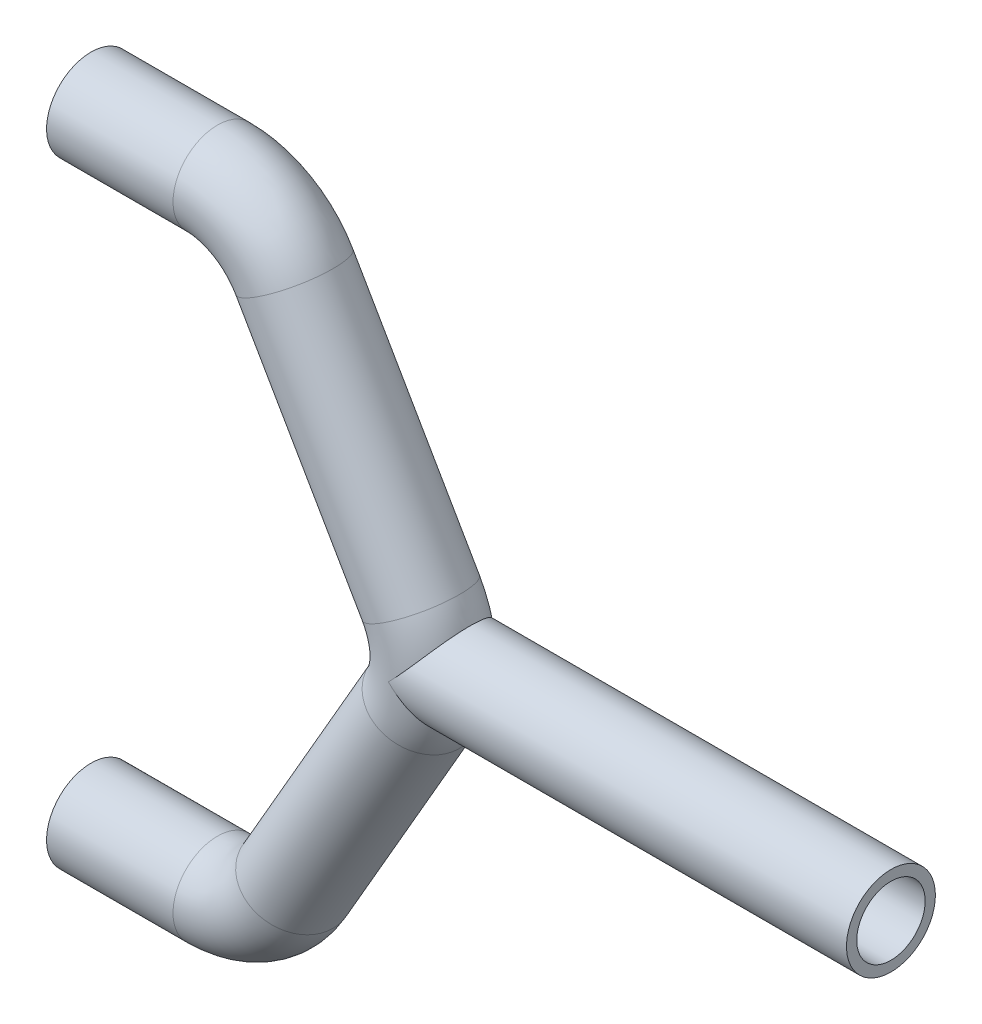
ISO-10303-21;
HEADER;
FILE_DESCRIPTION(('STEP AP214'),'2;1');
FILE_NAME('part.step','',(''),(''),'','','');
FILE_SCHEMA(('AUTOMOTIVE_DESIGN { 1 0 10303 214 1 1 1 1 }'));
ENDSEC;
DATA;
#1=APPLICATION_CONTEXT('core data for automotive mechanical design processes');
#2=APPLICATION_PROTOCOL_DEFINITION('international standard','automotive_design',2000,#1);
#3=PRODUCT_CONTEXT('',#1,'mechanical');
#4=PRODUCT('Part','Part','',(#3));
#5=PRODUCT_RELATED_PRODUCT_CATEGORY('part','',(#4));
#6=PRODUCT_DEFINITION_FORMATION('','',#4);
#7=PRODUCT_DEFINITION_CONTEXT('part definition',#1,'design');
#8=PRODUCT_DEFINITION('design','',#6,#7);
#9=PRODUCT_DEFINITION_SHAPE('','',#8);
#10=(LENGTH_UNIT() NAMED_UNIT(*) SI_UNIT(.MILLI.,.METRE.));
#11=(NAMED_UNIT(*) PLANE_ANGLE_UNIT() SI_UNIT($,.RADIAN.));
#12=(NAMED_UNIT(*) SI_UNIT($,.STERADIAN.) SOLID_ANGLE_UNIT());
#13=UNCERTAINTY_MEASURE_WITH_UNIT(LENGTH_MEASURE(1.E-05),#10,'distance_accuracy_value','');
#14=(GEOMETRIC_REPRESENTATION_CONTEXT(3) GLOBAL_UNCERTAINTY_ASSIGNED_CONTEXT((#13)) GLOBAL_UNIT_ASSIGNED_CONTEXT((#10,
#11,#12)) REPRESENTATION_CONTEXT('',''));
#15=CARTESIAN_POINT('',(0.,0.,0.));
#16=DIRECTION('',(0.,0.,1.));
#17=DIRECTION('',(1.,0.,0.));
#18=AXIS2_PLACEMENT_3D('',#15,#16,#17);
#19=CARTESIAN_POINT('',(-79.9999999999998,-69.2820323027552,0.));
#20=DIRECTION('',(1.,0.,0.));
#21=DIRECTION('',(0.,0.,-1.));
#22=AXIS2_PLACEMENT_3D('',#19,#20,#21);
#23=PLANE('',#22);
#24=CARTESIAN_POINT('',(-79.9999999999998,-69.2820323027552,0.));
#25=DIRECTION('',(1.,0.,0.));
#26=DIRECTION('',(0.,0.,-1.));
#27=AXIS2_PLACEMENT_3D('',#24,#25,#26);
#28=CIRCLE('',#27,7.7);
#29=CARTESIAN_POINT('',(-79.9999999999998,-69.2820323027552,-7.7));
#30=VERTEX_POINT('',#29);
#31=EDGE_CURVE('E85',#30,#30,#28,.T.);
#32=ORIENTED_EDGE('',*,*,#31,.T.);
#33=EDGE_LOOP('',(#32));
#34=FACE_BOUND('',#33,.T.);
#35=CARTESIAN_POINT('',(-79.9999999999998,-69.2820323027552,0.));
#36=DIRECTION('',(1.,0.,0.));
#37=DIRECTION('',(0.,0.,-1.));
#38=AXIS2_PLACEMENT_3D('',#35,#36,#37);
#39=CIRCLE('',#38,10.);
#40=CARTESIAN_POINT('',(-79.9999999999998,-69.2820323027552,-10.));
#41=VERTEX_POINT('',#40);
#42=EDGE_CURVE('E204',#41,#41,#39,.T.);
#43=ORIENTED_EDGE('',*,*,#42,.F.);
#44=EDGE_LOOP('',(#43));
#45=FACE_BOUND('',#44,.T.);
#46=ADVANCED_FACE('F53',(#34,#45),#23,.F.);
#47=CARTESIAN_POINT('',(-79.9999999999998,69.2820323027552,0.));
#48=DIRECTION('',(-1.,0.,0.));
#49=DIRECTION('',(0.,0.,-1.));
#50=AXIS2_PLACEMENT_3D('',#47,#48,#49);
#51=PLANE('',#50);
#52=CARTESIAN_POINT('',(-79.9999999999998,69.2820323027552,0.));
#53=DIRECTION('',(-1.,0.,0.));
#54=DIRECTION('',(0.,0.,1.));
#55=AXIS2_PLACEMENT_3D('',#52,#53,#54);
#56=CIRCLE('',#55,7.7);
#57=CARTESIAN_POINT('',(-79.9999999999998,69.2820323027552,7.7));
#58=VERTEX_POINT('',#57);
#59=EDGE_CURVE('E165',#58,#58,#56,.T.);
#60=ORIENTED_EDGE('',*,*,#59,.F.);
#61=EDGE_LOOP('',(#60));
#62=FACE_BOUND('',#61,.T.);
#63=CARTESIAN_POINT('',(-79.9999999999998,69.2820323027552,0.));
#64=DIRECTION('',(-1.,0.,0.));
#65=DIRECTION('',(0.,0.,-1.));
#66=AXIS2_PLACEMENT_3D('',#63,#64,#65);
#67=CIRCLE('',#66,10.);
#68=CARTESIAN_POINT('',(-79.9999999999998,69.2820323027552,-10.));
#69=VERTEX_POINT('',#68);
#70=EDGE_CURVE('E12',#69,#69,#67,.T.);
#71=ORIENTED_EDGE('',*,*,#70,.T.);
#72=EDGE_LOOP('',(#71));
#73=FACE_BOUND('',#72,.T.);
#74=ADVANCED_FACE('F201',(#62,#73),#51,.T.);
#75=CARTESIAN_POINT('',(-79.9999999999998,-69.2820323027552,0.));
#76=DIRECTION('',(1.,0.,0.));
#77=DIRECTION('',(0.,0.,-1.));
#78=AXIS2_PLACEMENT_3D('',#75,#76,#77);
#79=CYLINDRICAL_SURFACE('',#78,10.);
#80=CARTESIAN_POINT('',(-51.5470053837925,-69.2820323027552,0.));
#81=DIRECTION('',(1.,0.,0.));
#82=DIRECTION('',(0.,0.,-1.));
#83=AXIS2_PLACEMENT_3D('',#80,#81,#82);
#84=CIRCLE('',#83,10.);
#85=CARTESIAN_POINT('',(-51.5470053837925,-79.2820323027556,0.));
#86=VERTEX_POINT('',#85);
#87=EDGE_CURVE('E207',#86,#86,#84,.T.);
#88=ORIENTED_EDGE('',*,*,#87,.F.);
#89=EDGE_LOOP('',(#88));
#90=FACE_BOUND('',#89,.T.);
#91=ORIENTED_EDGE('',*,*,#42,.T.);
#92=EDGE_LOOP('',(#91));
#93=FACE_BOUND('',#92,.T.);
#94=ADVANCED_FACE('F261',(#90,#93),#79,.T.);
#95=CARTESIAN_POINT('',(-51.5470053837924,-49.2820323027552,0.));
#96=DIRECTION('',(0.,0.,1.));
#97=DIRECTION('',(1.,0.,0.));
#98=AXIS2_PLACEMENT_3D('',#95,#96,#97);
#99=TOROIDAL_SURFACE('',#98,20.0000000000004,10.);
#100=CARTESIAN_POINT('',(-34.2264973081035,-59.2820323027551,0.));
#101=DIRECTION('',(0.499999999999994,0.866025403784442,0.));
#102=DIRECTION('',(0.,0.,-1.));
#103=AXIS2_PLACEMENT_3D('',#100,#101,#102);
#104=CIRCLE('',#103,10.);
#105=CARTESIAN_POINT('',(-25.5662432702587,-64.2820323027552,0.));
#106=VERTEX_POINT('',#105);
#107=EDGE_CURVE('E212',#106,#106,#104,.T.);
#108=CARTESIAN_POINT('',(-51.5470053837924,-49.2820323027552,0.));
#109=DIRECTION('',(0.,0.,1.));
#110=DIRECTION('',(1.,0.,0.));
#111=AXIS2_PLACEMENT_3D('',#108,#109,#110);
#112=CIRCLE('',#111,30.0000000000004);
#113=EDGE_CURVE('',#86,#106,#112,.T.);
#114=ORIENTED_EDGE('',*,*,#87,.T.);
#115=ORIENTED_EDGE('',*,*,#107,.F.);
#116=ORIENTED_EDGE('',*,*,#113,.T.);
#117=ORIENTED_EDGE('',*,*,#113,.F.);
#118=EDGE_LOOP('',(#114,#116,#115,#117));
#119=FACE_BOUND('',#118,.T.);
#120=ADVANCED_FACE('F255',(#119),#99,.T.);
#121=CARTESIAN_POINT('',(-34.2264973081035,-59.2820323027551,0.));
#122=DIRECTION('',(0.499999999999998,0.86602540378444,0.));
#123=DIRECTION('',(-0.86602540378444,0.499999999999998,0.));
#124=AXIS2_PLACEMENT_3D('',#121,#122,#123);
#125=CYLINDRICAL_SURFACE('',#124,10.);
#126=CARTESIAN_POINT('',(-5.7735026918962,-9.99999999999995,0.));
#127=DIRECTION('',(0.499999999999998,0.86602540378444,0.));
#128=DIRECTION('',(0.,0.,-1.));
#129=AXIS2_PLACEMENT_3D('',#126,#127,#128);
#130=CIRCLE('',#129,10.);
#131=CARTESIAN_POINT('',(-5.7735026918962,-9.99999999999995,-10.));
#132=VERTEX_POINT('',#131);
#133=EDGE_CURVE('E218',#132,#132,#130,.T.);
#134=ORIENTED_EDGE('',*,*,#133,.F.);
#135=EDGE_LOOP('',(#134));
#136=FACE_BOUND('',#135,.T.);
#137=ORIENTED_EDGE('',*,*,#107,.T.);
#138=EDGE_LOOP('',(#137));
#139=FACE_BOUND('',#138,.T.);
#140=ADVANCED_FACE('F249',(#136,#139),#125,.T.);
#141=CARTESIAN_POINT('',(-23.094010767585,0.,0.));
#142=DIRECTION('',(0.,0.,1.));
#143=DIRECTION('',(1.,0.,0.));
#144=AXIS2_PLACEMENT_3D('',#141,#142,#143);
#145=TOROIDAL_SURFACE('',#144,20.,10.);
#146=CARTESIAN_POINT('',(-3.094010767585,0.,-10.));
#147=CARTESIAN_POINT('',(-3.08929674735372,-0.00471401804463564,-10.0000000008236));
#148=CARTESIAN_POINT('',(-3.08458353438937,-0.00942889772434871,-9.99999666750356));
#149=CARTESIAN_POINT('',(-2.78144194122758,-0.312784942865242,-9.99956752964785));
#150=CARTESIAN_POINT('',(-2.48625985614368,-0.614863589772334,-9.98575914980761));
#151=CARTESIAN_POINT('',(-1.90354849074706,-1.22376923185965,-9.92954725907919));
#152=CARTESIAN_POINT('',(-1.61602061555535,-1.53059708274713,-9.88713853500289));
#153=CARTESIAN_POINT('',(-1.04925691139065,-2.1472684898138,-9.77178577673054));
#154=CARTESIAN_POINT('',(-0.770036615020611,-2.45711641317143,-9.69878797516481));
#155=CARTESIAN_POINT('',(-0.22182266923447,-3.07654711430385,-9.52043594187605));
#156=CARTESIAN_POINT('',(0.0471727781712034,-3.38612992925028,-9.41508742872353));
#157=CARTESIAN_POINT('',(0.530179526839191,-3.95134930605322,-9.19040502507429));
#158=CARTESIAN_POINT('',(0.745972238721851,-4.20750495677449,-9.07619977794326));
#159=CARTESIAN_POINT('',(1.16815277796409,-4.71520132921828,-8.82311061549015));
#160=CARTESIAN_POINT('',(1.37454451178882,-4.96674394139173,-8.68423707052673));
#161=CARTESIAN_POINT('',(1.77653778580308,-5.46259564648135,-8.38119219107786));
#162=CARTESIAN_POINT('',(1.97215132521858,-5.70691263716862,-8.21704979373616));
#163=CARTESIAN_POINT('',(2.3514174592913,-6.18584682059702,-7.86282186290678));
#164=CARTESIAN_POINT('',(2.5350722658092,-6.42046580411154,-7.67274114716151));
#165=CARTESIAN_POINT('',(2.85693914935496,-6.8357690679285,-7.30308156282228));
#166=CARTESIAN_POINT('',(2.99737441832685,-7.01855095910298,-7.12778799574254));
#167=CARTESIAN_POINT('',(3.26818475929134,-7.3736756607877,-6.75975364888943));
#168=CARTESIAN_POINT('',(3.39856190130461,-7.54602061770095,-6.56701647695049));
#169=CARTESIAN_POINT('',(3.64827116970423,-7.87835119334205,-6.16439170262475));
#170=CARTESIAN_POINT('',(3.76760180846392,-8.03833514694195,-5.95450179743385));
#171=CARTESIAN_POINT('',(3.9941218531217,-8.34385243798727,-5.5182454730351));
#172=CARTESIAN_POINT('',(4.10131105819483,-8.48938553640393,-5.29187878139524));
#173=CARTESIAN_POINT('',(4.30326543144987,-8.76501144269363,-4.82176495839224));
#174=CARTESIAN_POINT('',(4.39792112675363,-8.89496736633595,-4.57789015426692));
#175=CARTESIAN_POINT('',(4.57263713840298,-9.135894203506,-4.07589693859427));
#176=CARTESIAN_POINT('',(4.65269706331431,-9.24686460786882,-3.81777814528862));
#177=CARTESIAN_POINT('',(4.7970978660561,-9.44771815397634,-3.28944180436255));
#178=CARTESIAN_POINT('',(4.8614507038933,-9.53761733811013,-3.01923364875903));
#179=CARTESIAN_POINT('',(4.97356689082402,-9.69464407859717,-2.46894645165665));
#180=CARTESIAN_POINT('',(5.02133327595183,-9.76177580232249,-2.18886922697091));
#181=CARTESIAN_POINT('',(5.0940114728746,-9.86408696837469,-1.66173645010473));
#182=CARTESIAN_POINT('',(5.12119844600319,-9.90244024169851,-1.41560440177301));
#183=CARTESIAN_POINT('',(5.16246879118537,-9.96070516832672,-0.92008702152945));
#184=CARTESIAN_POINT('',(5.17655354758679,-9.98061876992024,-0.670702036138899));
#185=CARTESIAN_POINT('',(5.19144078918687,-10.0016678714188,-0.170856392611323));
#186=CARTESIAN_POINT('',(5.19224902974087,-10.0028115080833,0.0796037523431822));
#187=CARTESIAN_POINT('',(5.18058768624097,-9.98632206816372,0.579591872273298));
#188=CARTESIAN_POINT('',(5.16811852150655,-9.96868958455645,0.829119876437509));
#189=CARTESIAN_POINT('',(5.13154727203139,-9.91704562203236,1.30580646458638));
#190=CARTESIAN_POINT('',(5.10842769240418,-9.88441795929257,1.53319261840903));
#191=CARTESIAN_POINT('',(5.05127840276221,-9.80391215437385,1.98385974617834));
#192=CARTESIAN_POINT('',(5.01724844687225,-9.75603366850395,2.20714062748904));
#193=CARTESIAN_POINT('',(4.93862269159097,-9.64567488834745,2.64813537646476));
#194=CARTESIAN_POINT('',(4.89402764617947,-9.58319563605189,2.86584964016477));
#195=CARTESIAN_POINT('',(4.79469296834377,-9.44443327972805,3.29445374877942));
#196=CARTESIAN_POINT('',(4.73995292026083,-9.36814961011134,3.50534331365806));
#197=CARTESIAN_POINT('',(4.61894509294199,-9.20010373894107,3.92567387508839));
#198=CARTESIAN_POINT('',(4.55236954838351,-9.10793103319432,4.13486188251668));
#199=CARTESIAN_POINT('',(4.40949981352887,-8.91094979129702,4.54384388768399));
#200=CARTESIAN_POINT('',(4.33320184133844,-8.80613633891945,4.74363418821296));
#201=CARTESIAN_POINT('',(4.17151952534541,-8.58506523684635,5.13290912216239));
#202=CARTESIAN_POINT('',(4.08613564068058,-8.46880816545263,5.3223942756016));
#203=CARTESIAN_POINT('',(3.90688759535934,-8.22601199078087,5.69046093790626));
#204=CARTESIAN_POINT('',(3.81302244979203,-8.09947169350566,5.8690411763612));
#205=CARTESIAN_POINT('',(3.60590895590635,-7.82184420625646,6.23518746314478));
#206=CARTESIAN_POINT('',(3.49167952670542,-7.66962080973474,6.42133744902898));
#207=CARTESIAN_POINT('',(3.25421615598083,-7.35537409060199,6.77902346445779));
#208=CARTESIAN_POINT('',(3.13098176460034,-7.19335027846575,6.95055876297459));
#209=CARTESIAN_POINT('',(2.87621676944544,-6.86091219740833,7.27890736446988));
#210=CARTESIAN_POINT('',(2.74468170555156,-6.6904934286836,7.43571263814832));
#211=CARTESIAN_POINT('',(2.47409081634158,-6.34273751158577,7.73448483140901));
#212=CARTESIAN_POINT('',(2.33503357549742,-6.16539906282485,7.87644894332856));
#213=CARTESIAN_POINT('',(1.98610722620266,-5.7242436624279,8.20604342792944));
#214=CARTESIAN_POINT('',(1.77246307289125,-5.45732982462219,8.38557993822634));
#215=CARTESIAN_POINT('',(1.33260925887461,-4.91528396233879,8.71438740899812));
#216=CARTESIAN_POINT('',(1.10639480262641,-4.64014882021345,8.86364671639155));
#217=CARTESIAN_POINT('',(0.642840630034719,-4.08460874934345,9.13298089587871));
#218=CARTESIAN_POINT('',(0.405491388609234,-3.80419943639899,9.25303021699652));
#219=CARTESIAN_POINT('',(-0.0788377988011067,-3.24098808839095,9.46501809885898));
#220=CARTESIAN_POINT('',(-0.325820439477215,-2.95818540141843,9.55694872962444));
#221=CARTESIAN_POINT('',(-0.776498149456633,-2.45078892280838,9.69783355250617));
#222=CARTESIAN_POINT('',(-0.978652410197169,-2.22618227614695,9.75173770678574));
#223=CARTESIAN_POINT('',(-1.38767175086048,-1.77808223336963,9.84330926257699));
#224=CARTESIAN_POINT('',(-1.5945361621448,-1.55458868466408,9.88097895373934));
#225=CARTESIAN_POINT('',(-2.22093799099895,-0.88778254957518,9.97058845104139));
#226=CARTESIAN_POINT('',(-2.64710039255051,-0.447221886017204,9.99937707171359));
#227=CARTESIAN_POINT('',(-3.08458356066046,-0.00942886754752954,9.99999667058241));
#228=CARTESIAN_POINT('',(-3.08929677379236,-0.00471398766151835,10.0000000039187));
#229=CARTESIAN_POINT('',(-3.094010767585,0.,10.));
#230=B_SPLINE_CURVE_WITH_KNOTS('',3,(#146,#147,#148,#149,#150,#151,#152,#153,#154,#155,#156,
#157,#158,#159,#160,#161,#162,#163,#164,#165,#166,#167,#168,#169,#170,#171,#172,#173,#174,#175,
#176,#177,#178,#179,#180,#181,#182,#183,#184,#185,#186,#187,#188,#189,#190,#191,#192,#193,#194,
#195,#196,#197,#198,#199,#200,#201,#202,#203,#204,#205,#206,#207,#208,#209,#210,#211,#212,#213,
#214,#215,#216,#217,#218,#219,#220,#221,#222,#223,#224,#225,#226,#227,#228,#229),.UNSPECIFIED.,
.F.,.F.,(4,2,2,2,2,2,2,2,2,2,2,2,2,2,2,2,2,2,2,2,2,2,2,2,2,2,2,2,2,2,2,2,2,2,2,2,2,2,2,2,2,4),
(0.,0.020000002814049,1.28656914846771,2.553369223107,3.82240539415876,5.09121736923189,
6.15190267688667,7.21214313154289,8.27117834010292,9.33001711219239,10.1979541215123,
11.0657120251928,11.9335866198732,12.8014755675068,13.6765049667975,14.5515578294683,
15.4259422984423,16.3001666329755,17.0509098744803,17.8015737852976,18.5519122755253,
19.3022270696911,19.9940573772586,20.685903276945,21.3776998177695,22.0695247089928,
22.7830529004135,23.4968594968964,24.210630039756,24.9244835780731,25.7223526763411,
26.5202616606815,27.3186030896169,28.1170952771419,29.2738947361861,30.4311385826372,
31.5893910997973,32.7479699645745,33.6683362445421,34.5885726768255,36.4252931701681,
36.4452931729821),.UNSPECIFIED.);
#231=CARTESIAN_POINT('',(-3.094010767585,0.,-10.0000000000002));
#232=VERTEX_POINT('',#231);
#233=CARTESIAN_POINT('',(-3.094010767585,0.,10.));
#234=VERTEX_POINT('',#233);
#235=EDGE_CURVE('E70',#232,#234,#230,.T.);
#236=ORIENTED_EDGE('',*,*,#235,.T.);
#237=CARTESIAN_POINT('',(-3.094010767585,0.,10.));
#238=CARTESIAN_POINT('',(-3.08929674735371,0.00471401804463571,10.0000000008236));
#239=CARTESIAN_POINT('',(-3.08458353438937,0.00942889772434877,9.99999666750356));
#240=CARTESIAN_POINT('',(-2.78144194199858,0.312784942093693,9.99956752964894));
#241=CARTESIAN_POINT('',(-2.4862598576691,0.614863588211243,9.98575914987895));
#242=CARTESIAN_POINT('',(-1.90354849373904,1.22376922870025,9.92954725944366));
#243=CARTESIAN_POINT('',(-1.61602061925948,1.53059707877894,9.88713853559025));
#244=CARTESIAN_POINT('',(-1.04925691500517,2.14726848581877,9.77178577763302));
#245=CARTESIAN_POINT('',(-0.770036617878774,2.45711640997113,9.69878797600239));
#246=CARTESIAN_POINT('',(-0.221822670625672,3.07654711270276,9.5204359424209));
#247=CARTESIAN_POINT('',(0.0471727774904813,3.38612992845367,9.41508742904017));
#248=CARTESIAN_POINT('',(0.530179529115006,3.95134930871643,9.19040502401565));
#249=CARTESIAN_POINT('',(0.745972243188527,4.20750496207671,9.07619977557944));
#250=CARTESIAN_POINT('',(1.16815278660446,4.715201339678,8.82311060999674));
#251=CARTESIAN_POINT('',(1.37454452241228,4.96674395437006,8.68423706320953));
#252=CARTESIAN_POINT('',(1.77653779598998,5.46259565917193,8.38119218270785));
#253=CARTESIAN_POINT('',(1.97215133320388,5.70691264719638,8.21704978666286));
#254=CARTESIAN_POINT('',(2.35141746310043,6.18584682546314,7.8628218589645));
#255=CARTESIAN_POINT('',(2.53507226764407,6.42046580647909,7.67274114505419));
#256=CARTESIAN_POINT('',(2.85693914555654,6.83576906302739,7.3030815671847));
#257=CARTESIAN_POINT('',(2.99737441096778,7.01855094952479,7.12778800492812));
#258=CARTESIAN_POINT('',(3.26818474536523,7.37367564245379,6.75975366863029));
#259=CARTESIAN_POINT('',(3.39856188437172,7.54602059528802,6.56701650242279));
#260=CARTESIAN_POINT('',(3.64827115392744,7.87835117222291,6.16439172989252));
#261=CARTESIAN_POINT('',(3.7676017962715,8.03833513054806,5.9545018198701));
#262=CARTESIAN_POINT('',(3.99412184749914,8.34385243035333,5.51824548490872));
#263=CARTESIAN_POINT('',(4.10131105555677,8.48938553280352,5.29187878753641));
#264=CARTESIAN_POINT('',(4.3032654359938,8.76501144889517,4.82176494781453));
#265=CARTESIAN_POINT('',(4.397921135239,8.89496737798573,4.5778901324041));
#266=CARTESIAN_POINT('',(4.57263715340269,9.1358942242413,4.07589689298017));
#267=CARTESIAN_POINT('',(4.65269708088875,9.24686463224377,3.81777808721015));
#268=CARTESIAN_POINT('',(4.79709788082421,9.44771817458813,3.28944174411032));
#269=CARTESIAN_POINT('',(4.86145071468045,9.53761735319717,3.01923359989668));
#270=CARTESIAN_POINT('',(4.97356689510255,9.69464408461076,2.46894642657592));
#271=CARTESIAN_POINT('',(5.02133327770192,9.76177580478632,2.18886921428144));
#272=CARTESIAN_POINT('',(5.09401147464032,9.8640869708602,1.66173643729463));
#273=CARTESIAN_POINT('',(5.12119844886443,9.90244024573467,1.41560437586768));
#274=CARTESIAN_POINT('',(5.16246879484473,9.9607051734963,0.920086969147486));
#275=CARTESIAN_POINT('',(5.17655355094663,9.98061877466959,0.67070197037498));
#276=CARTESIAN_POINT('',(5.1914407897562,10.0016678722249,0.170856326467199));
#277=CARTESIAN_POINT('',(5.19224902921297,10.0028115073369,-0.0796038053613938));
#278=CARTESIAN_POINT('',(5.18058768491272,9.98632206628553,-0.579591898843477));
#279=CARTESIAN_POINT('',(5.1681185204877,9.96868958311673,-0.829119889686439));
#280=CARTESIAN_POINT('',(5.13154728690415,9.91704564303573,-1.3058062707568));
#281=CARTESIAN_POINT('',(5.10842773160886,9.88441801462386,-1.53319223286262));
#282=CARTESIAN_POINT('',(5.05127850891158,9.80391230380182,-1.9838589854897));
#283=CARTESIAN_POINT('',(5.01724859563085,9.75603387769578,-2.20713968337371));
#284=CARTESIAN_POINT('',(4.93862287610619,9.64567514693798,-2.64813445131937));
#285=CARTESIAN_POINT('',(4.89402780593062,9.58319585952387,-2.86584890800764));
#286=CARTESIAN_POINT('',(4.79469306109121,9.44443340897605,-3.29445339147309));
#287=CARTESIAN_POINT('',(4.73995297078066,9.36814968027027,-3.5053431382224));
#288=CARTESIAN_POINT('',(4.61894478125706,9.20010330609718,-3.92567495770078));
#289=CARTESIAN_POINT('',(4.55236887278252,9.10793009782938,-4.13486400521211));
#290=CARTESIAN_POINT('',(4.40949831426572,8.91094772807402,-4.54384799070657));
#291=CARTESIAN_POINT('',(4.33319988226183,8.80613365027257,-4.74363923141086));
#292=CARTESIAN_POINT('',(4.17151738124984,8.58506231513118,-5.13291395805353));
#293=CARTESIAN_POINT('',(4.08613386357804,8.46880575222045,-5.32239806843562));
#294=CARTESIAN_POINT('',(3.90688664185355,8.22601070533283,-5.69046275204492));
#295=CARTESIAN_POINT('',(3.81302195297558,8.09947102746284,-5.86904205497146));
#296=CARTESIAN_POINT('',(3.6059117228959,7.82184791538638,-6.23518257116469));
#297=CARTESIAN_POINT('',(3.49168530979683,7.6696285167028,-6.42132802338063));
#298=CARTESIAN_POINT('',(3.2542283559606,7.35539018149792,-6.77900580270825));
#299=CARTESIAN_POINT('',(3.1309973611623,7.19337075087548,-6.95053739196165));
#300=CARTESIAN_POINT('',(2.87623319148908,6.86093350548286,-7.27888746940709));
#301=CARTESIAN_POINT('',(2.74469514822902,6.69051077898913,-7.43569719339455));
#302=CARTESIAN_POINT('',(2.47409789293586,6.3427465320338,-7.7344776201176));
#303=CARTESIAN_POINT('',(2.33503726069601,6.16540370688449,-7.87644550588798));
#304=CARTESIAN_POINT('',(1.98608227623298,5.72421213967333,-8.20606693242746));
#305=CARTESIAN_POINT('',(1.77241118615844,5.45726509329269,-8.38562330360371));
#306=CARTESIAN_POINT('',(1.33250024234602,4.91515040845705,-8.71446431933096));
#307=CARTESIAN_POINT('',(1.10625547980138,4.6399795790637,-8.86373703375983));
#308=CARTESIAN_POINT('',(0.642686796782054,4.08442666449626,-9.13306089589864));
#309=CARTESIAN_POINT('',(0.405355904253863,3.80404136851041,-9.25309335136628));
#310=CARTESIAN_POINT('',(-0.0789033541558758,3.24091237420535,-9.46504295489337));
#311=CARTESIAN_POINT('',(-0.325834020584593,2.95816812348198,-9.55695331620962));
#312=CARTESIAN_POINT('',(-0.929692886057479,2.27831708733052,-9.7457227580193));
#313=CARTESIAN_POINT('',(-1.2907194349264,1.88120416098951,-9.82955077063117));
#314=CARTESIAN_POINT('',(-2.02597233777725,1.09318228116625,-9.94803820447603));
#315=CARTESIAN_POINT('',(-2.40017714783644,0.702264590395595,-9.98277437604092));
#316=CARTESIAN_POINT('',(-2.87956218427452,0.215349822700711,-9.99819318946658));
#317=CARTESIAN_POINT('',(-2.9795262790361,0.11456040388469,-9.99984797543457));
#318=CARTESIAN_POINT('',(-3.08458350366903,0.00942893175627761,-9.99999666602018));
#319=CARTESIAN_POINT('',(-3.08929671598541,0.00471405282226158,-9.99999999931526));
#320=CARTESIAN_POINT('',(-3.094010767585,0.,-10.));
#321=B_SPLINE_CURVE_WITH_KNOTS('',3,(#237,#238,#239,#240,#241,#242,#243,#244,#245,#246,#247,
#248,#249,#250,#251,#252,#253,#254,#255,#256,#257,#258,#259,#260,#261,#262,#263,#264,#265,#266,
#267,#268,#269,#270,#271,#272,#273,#274,#275,#276,#277,#278,#279,#280,#281,#282,#283,#284,#285,
#286,#287,#288,#289,#290,#291,#292,#293,#294,#295,#296,#297,#298,#299,#300,#301,#302,#303,#304,
#305,#306,#307,#308,#309,#310,#311,#312,#313,#314,#315,#316,#317,#318,#319,#320),.UNSPECIFIED.,
.F.,.F.,(4,2,2,2,2,2,2,2,2,2,2,2,2,2,2,2,2,2,2,2,2,2,2,2,2,2,2,2,2,2,2,2,2,2,2,2,2,2,2,2,2,4),
(0.,0.020000002814049,1.28656914519549,2.55336921656294,3.82240539087863,5.09121736923109,
6.15190268785895,7.21214315346582,8.27117835107977,9.33001711219434,10.197954098784,
11.0657119797627,11.9335865971215,12.8014755675036,13.6765050059915,14.5515579077492,
15.4259423375687,16.3001666329811,17.0509099139722,17.8015738644014,18.5519123154344,
19.3022270696975,19.9940567910283,20.6859021047138,21.377699232105,22.0695247090507,
22.7830565192654,23.4968667381701,24.2106336635619,24.9244835776449,25.7223324819111,
26.5202216459613,27.3185828358686,28.1170952798335,29.2740339804581,30.4314275710706,
31.5895591113886,32.7479699251192,34.3748649136996,35.9992135854146,36.4250919056127,
36.4450919084267),.UNSPECIFIED.);
#322=EDGE_CURVE('E67',#234,#232,#321,.T.);
#323=ORIENTED_EDGE('',*,*,#322,.T.);
#324=EDGE_LOOP('',(#236,#323));
#325=FACE_BOUND('',#324,.T.);
#326=CARTESIAN_POINT('',(-5.77350269189625,10.,0.));
#327=DIRECTION('',(-0.500000000000002,0.866025403784438,0.));
#328=DIRECTION('',(0.,0.,-1.));
#329=AXIS2_PLACEMENT_3D('',#326,#327,#328);
#330=CIRCLE('',#329,10.);
#331=CARTESIAN_POINT('',(-5.77350269189625,10.,-10.));
#332=VERTEX_POINT('',#331);
#333=EDGE_CURVE('E222',#332,#332,#330,.T.);
#334=ORIENTED_EDGE('',*,*,#333,.F.);
#335=EDGE_LOOP('',(#334));
#336=FACE_BOUND('',#335,.T.);
#337=ORIENTED_EDGE('',*,*,#133,.T.);
#338=EDGE_LOOP('',(#337));
#339=FACE_BOUND('',#338,.T.);
#340=ADVANCED_FACE('F243',(#325,#336,#339),#145,.T.);
#341=CARTESIAN_POINT('',(-5.77350269189625,10.,0.));
#342=DIRECTION('',(-0.499999999999998,0.86602540378444,0.));
#343=DIRECTION('',(-0.86602540378444,-0.499999999999998,0.));
#344=AXIS2_PLACEMENT_3D('',#341,#342,#343);
#345=CYLINDRICAL_SURFACE('',#344,10.);
#346=CARTESIAN_POINT('',(-34.2264973081035,59.2820323027551,0.));
#347=DIRECTION('',(-0.499999999999998,0.86602540378444,0.));
#348=DIRECTION('',(0.,0.,-1.));
#349=AXIS2_PLACEMENT_3D('',#346,#347,#348);
#350=CIRCLE('',#349,10.);
#351=CARTESIAN_POINT('',(-25.5662432702591,64.282032302755,0.));
#352=VERTEX_POINT('',#351);
#353=EDGE_CURVE('E226',#352,#352,#350,.T.);
#354=ORIENTED_EDGE('',*,*,#353,.F.);
#355=EDGE_LOOP('',(#354));
#356=FACE_BOUND('',#355,.T.);
#357=ORIENTED_EDGE('',*,*,#333,.T.);
#358=EDGE_LOOP('',(#357));
#359=FACE_BOUND('',#358,.T.);
#360=ADVANCED_FACE('F237',(#356,#359),#345,.T.);
#361=CARTESIAN_POINT('',(-51.5470053837924,49.2820323027552,0.));
#362=DIRECTION('',(0.,0.,1.));
#363=DIRECTION('',(1.,0.,0.));
#364=AXIS2_PLACEMENT_3D('',#361,#362,#363);
#365=TOROIDAL_SURFACE('',#364,20.,10.);
#366=CARTESIAN_POINT('',(-51.5470053837925,69.2820323027552,0.));
#367=DIRECTION('',(-1.,0.,0.));
#368=DIRECTION('',(0.,0.,-1.));
#369=AXIS2_PLACEMENT_3D('',#366,#367,#368);
#370=CIRCLE('',#369,10.);
#371=CARTESIAN_POINT('',(-51.5470053837925,79.2820323027552,0.));
#372=VERTEX_POINT('',#371);
#373=EDGE_CURVE('E61',#372,#372,#370,.T.);
#374=CARTESIAN_POINT('',(-51.5470053837924,49.2820323027552,0.));
#375=DIRECTION('',(0.,0.,1.));
#376=DIRECTION('',(1.,0.,0.));
#377=AXIS2_PLACEMENT_3D('',#374,#375,#376);
#378=CIRCLE('',#377,30.);
#379=EDGE_CURVE('',#352,#372,#378,.T.);
#380=ORIENTED_EDGE('',*,*,#353,.T.);
#381=ORIENTED_EDGE('',*,*,#373,.F.);
#382=ORIENTED_EDGE('',*,*,#379,.T.);
#383=ORIENTED_EDGE('',*,*,#379,.F.);
#384=EDGE_LOOP('',(#380,#382,#381,#383));
#385=FACE_BOUND('',#384,.T.);
#386=ADVANCED_FACE('F234',(#385),#365,.T.);
#387=CARTESIAN_POINT('',(-51.5470053837925,69.2820323027552,0.));
#388=DIRECTION('',(-1.,0.,0.));
#389=DIRECTION('',(0.,0.,1.));
#390=AXIS2_PLACEMENT_3D('',#387,#388,#389);
#391=CYLINDRICAL_SURFACE('',#390,10.);
#392=ORIENTED_EDGE('',*,*,#70,.F.);
#393=EDGE_LOOP('',(#392));
#394=FACE_BOUND('',#393,.T.);
#395=ORIENTED_EDGE('',*,*,#373,.T.);
#396=EDGE_LOOP('',(#395));
#397=FACE_BOUND('',#396,.T.);
#398=ADVANCED_FACE('F146',(#394,#397),#391,.T.);
#399=CARTESIAN_POINT('',(-80.0009999999998,0.,0.));
#400=DIRECTION('',(1.,0.,0.));
#401=DIRECTION('',(0.,0.,-1.));
#402=AXIS2_PLACEMENT_3D('',#399,#400,#401);
#403=CYLINDRICAL_SURFACE('',#402,10.);
#404=ORIENTED_EDGE('',*,*,#322,.F.);
#405=ORIENTED_EDGE('',*,*,#235,.F.);
#406=EDGE_LOOP('',(#404,#405));
#407=FACE_BOUND('',#406,.T.);
#408=CARTESIAN_POINT('',(100.,0.,0.));
#409=DIRECTION('',(1.,0.,0.));
#410=DIRECTION('',(0.,0.,-1.));
#411=AXIS2_PLACEMENT_3D('',#408,#409,#410);
#412=CIRCLE('',#411,10.);
#413=CARTESIAN_POINT('',(100.,0.,-10.));
#414=VERTEX_POINT('',#413);
#415=EDGE_CURVE('E163',#414,#414,#412,.T.);
#416=ORIENTED_EDGE('',*,*,#415,.F.);
#417=EDGE_LOOP('',(#416));
#418=FACE_BOUND('',#417,.T.);
#419=ADVANCED_FACE('F141',(#407,#418),#403,.T.);
#420=CARTESIAN_POINT('',(100.,0.,0.));
#421=DIRECTION('',(1.,0.,0.));
#422=DIRECTION('',(0.,0.,-1.));
#423=AXIS2_PLACEMENT_3D('',#420,#421,#422);
#424=PLANE('',#423);
#425=CARTESIAN_POINT('',(100.,0.,0.));
#426=DIRECTION('',(1.,0.,0.));
#427=DIRECTION('',(0.,0.,-1.));
#428=AXIS2_PLACEMENT_3D('',#425,#426,#427);
#429=CIRCLE('',#428,7.7);
#430=CARTESIAN_POINT('',(100.,0.,-7.7));
#431=VERTEX_POINT('',#430);
#432=EDGE_CURVE('E90',#431,#431,#429,.T.);
#433=ORIENTED_EDGE('',*,*,#432,.F.);
#434=EDGE_LOOP('',(#433));
#435=FACE_BOUND('',#434,.T.);
#436=ORIENTED_EDGE('',*,*,#415,.T.);
#437=EDGE_LOOP('',(#436));
#438=FACE_BOUND('',#437,.T.);
#439=ADVANCED_FACE('F119',(#435,#438),#424,.T.);
#440=CARTESIAN_POINT('',(-79.9999999999998,-69.2820323027552,0.));
#441=DIRECTION('',(1.,0.,0.));
#442=DIRECTION('',(0.,0.,-1.));
#443=AXIS2_PLACEMENT_3D('',#440,#441,#442);
#444=CYLINDRICAL_SURFACE('',#443,7.7);
#445=CARTESIAN_POINT('',(-51.5470053837925,-69.2820323027556,0.));
#446=DIRECTION('',(-1.,0.,0.));
#447=DIRECTION('',(0.,-1.,0.));
#448=AXIS2_PLACEMENT_3D('',#445,#446,#447);
#449=CIRCLE('',#448,7.7);
#450=CARTESIAN_POINT('',(-51.5470053837925,-76.9820323027556,0.));
#451=VERTEX_POINT('',#450);
#452=EDGE_CURVE('E173',#451,#451,#449,.F.);
#453=ORIENTED_EDGE('',*,*,#452,.T.);
#454=EDGE_LOOP('',(#453));
#455=FACE_BOUND('',#454,.T.);
#456=ORIENTED_EDGE('',*,*,#31,.F.);
#457=EDGE_LOOP('',(#456));
#458=FACE_BOUND('',#457,.T.);
#459=ADVANCED_FACE('F114',(#455,#458),#444,.F.);
#460=CARTESIAN_POINT('',(-51.5470053837924,-49.2820323027552,0.));
#461=DIRECTION('',(0.,0.,1.));
#462=DIRECTION('',(1.,0.,0.));
#463=AXIS2_PLACEMENT_3D('',#460,#461,#462);
#464=TOROIDAL_SURFACE('',#463,20.0000000000004,7.7);
#465=CARTESIAN_POINT('',(-34.2264973081035,-59.2820323027551,0.));
#466=DIRECTION('',(0.499999999999998,0.86602540378444,0.));
#467=DIRECTION('',(-0.86602540378444,0.499999999999998,0.));
#468=AXIS2_PLACEMENT_3D('',#465,#466,#467);
#469=CIRCLE('',#468,7.7);
#470=CARTESIAN_POINT('',(-27.558101698963,-63.1320323027552,0.));
#471=VERTEX_POINT('',#470);
#472=EDGE_CURVE('E186',#471,#471,#469,.T.);
#473=CARTESIAN_POINT('',(-51.5470053837924,-49.2820323027552,0.));
#474=DIRECTION('',(0.,0.,1.));
#475=DIRECTION('',(1.,0.,0.));
#476=AXIS2_PLACEMENT_3D('',#473,#474,#475);
#477=CIRCLE('',#476,27.7000000000004);
#478=EDGE_CURVE('',#451,#471,#477,.T.);
#479=ORIENTED_EDGE('',*,*,#452,.F.);
#480=ORIENTED_EDGE('',*,*,#472,.T.);
#481=ORIENTED_EDGE('',*,*,#478,.T.);
#482=ORIENTED_EDGE('',*,*,#478,.F.);
#483=EDGE_LOOP('',(#479,#481,#480,#482));
#484=FACE_BOUND('',#483,.T.);
#485=ADVANCED_FACE('F118',(#484),#464,.F.);
#486=CARTESIAN_POINT('',(-34.2264973081035,-59.2820323027551,0.));
#487=DIRECTION('',(0.499999999999998,0.86602540378444,0.));
#488=DIRECTION('',(-0.86602540378444,0.499999999999998,0.));
#489=AXIS2_PLACEMENT_3D('',#486,#487,#488);
#490=CYLINDRICAL_SURFACE('',#489,7.7);
#491=CARTESIAN_POINT('',(-5.7735026918962,-9.99999999999996,0.));
#492=DIRECTION('',(-0.499999999999998,-0.86602540378444,0.));
#493=DIRECTION('',(0.86602540378444,-0.499999999999998,0.));
#494=AXIS2_PLACEMENT_3D('',#491,#492,#493);
#495=CIRCLE('',#494,7.7);
#496=CARTESIAN_POINT('',(0.894892917243983,-13.8499999999999,0.));
#497=VERTEX_POINT('',#496);
#498=EDGE_CURVE('E182',#497,#497,#495,.F.);
#499=ORIENTED_EDGE('',*,*,#498,.T.);
#500=EDGE_LOOP('',(#499));
#501=FACE_BOUND('',#500,.T.);
#502=ORIENTED_EDGE('',*,*,#472,.F.);
#503=EDGE_LOOP('',(#502));
#504=FACE_BOUND('',#503,.T.);
#505=ADVANCED_FACE('F123',(#501,#504),#490,.F.);
#506=CARTESIAN_POINT('',(-23.094010767585,0.,0.));
#507=DIRECTION('',(0.,0.,1.));
#508=DIRECTION('',(1.,0.,0.));
#509=AXIS2_PLACEMENT_3D('',#506,#507,#508);
#510=TOROIDAL_SURFACE('',#509,20.,7.7);
#511=CARTESIAN_POINT('',(-3.094010767585,0.,7.7));
#512=CARTESIAN_POINT('',(-3.08987428021863,-0.00413647729502275,7.70000000421965));
#513=CARTESIAN_POINT('',(-3.08573836260741,-0.00827367836481096,7.69999667093536));
#514=CARTESIAN_POINT('',(-2.62264188561783,-0.471658563619049,7.69924927824954));
#515=CARTESIAN_POINT('',(-2.17074303746851,-0.939757183543044,7.65735819775559));
#516=CARTESIAN_POINT('',(-1.51030834583224,-1.64518101089014,7.52601259911237));
#517=CARTESIAN_POINT('',(-1.29280893477571,-1.88116056658546,7.47070218989062));
#518=CARTESIAN_POINT('',(-0.86460100132091,-2.35252390524887,7.33591510816133));
#519=CARTESIAN_POINT('',(-0.653891533254526,-2.58790776693749,7.25644181716427));
#520=CARTESIAN_POINT('',(-0.269769427033634,-3.02286104374309,7.08512450709639));
#521=CARTESIAN_POINT('',(-0.0952870784649203,-3.22280059104747,6.99660481268273));
#522=CARTESIAN_POINT('',(0.246725024381156,-3.61901822136523,6.80011636832321));
#523=CARTESIAN_POINT('',(0.414256241145935,-3.81529706974029,6.69215173529873));
#524=CARTESIAN_POINT('',(0.741125404682145,-4.20217573770575,6.45623713340854));
#525=CARTESIAN_POINT('',(0.900472411274718,-4.39278173425142,6.32830992556148));
#526=CARTESIAN_POINT('',(1.20991997180532,-4.76642810344168,6.05187081464925));
#527=CARTESIAN_POINT('',(1.36002257144264,-4.94947014694586,5.90336348958097));
#528=CARTESIAN_POINT('',(1.6212322804481,-5.27074166233422,5.61659519994876));
#529=CARTESIAN_POINT('',(1.73422271170286,-5.4107315455154,5.48201515669462));
#530=CARTESIAN_POINT('',(1.95248466342386,-5.6828757529137,5.19936476885874));
#531=CARTESIAN_POINT('',(2.05775771138602,-5.81503162671405,5.05129710695314));
#532=CARTESIAN_POINT('',(2.25968134442003,-6.06998774187333,4.74187983474083));
#533=CARTESIAN_POINT('',(2.35633419363247,-6.19279043864874,4.58053373362078));
#534=CARTESIAN_POINT('',(2.54008497604453,-6.42746058793315,4.24495571640627));
#535=CARTESIAN_POINT('',(2.62718449834355,-6.53932985876878,4.07072595147584));
#536=CARTESIAN_POINT('',(2.77842964796546,-6.73445876744155,3.73744513210119));
#537=CARTESIAN_POINT('',(2.84405337350671,-6.8194846721484,3.58009660175974));
#538=CARTESIAN_POINT('',(2.96709626919432,-6.9794378676412,3.25728131270485));
#539=CARTESIAN_POINT('',(3.02451691200904,-7.05436697093024,3.09181601834673));
#540=CARTESIAN_POINT('',(3.13047152774434,-7.19301669449803,2.75387117866063));
#541=CARTESIAN_POINT('',(3.17902133813537,-7.2567572819417,2.58140481921065));
#542=CARTESIAN_POINT('',(3.26679234475029,-7.37225034003424,2.23026183637446));
#543=CARTESIAN_POINT('',(3.30601716127757,-7.42400746289783,2.05158765407231));
#544=CARTESIAN_POINT('',(3.37530193877589,-7.51558227116482,1.68588073533797));
#545=CARTESIAN_POINT('',(3.40518245431358,-7.55516596861117,1.49875511835203));
#546=CARTESIAN_POINT('',(3.45439247937329,-7.62042766884358,1.12066423554829));
#547=CARTESIAN_POINT('',(3.47371922583308,-7.64610203003887,0.929697977774664));
#548=CARTESIAN_POINT('',(3.5005000119428,-7.6816960021755,0.559869584954561));
#549=CARTESIAN_POINT('',(3.5087291253208,-7.69264395819926,0.381161662792758));
#550=CARTESIAN_POINT('',(3.5157976289537,-7.70204723494092,0.0231687327067078));
#551=CARTESIAN_POINT('',(3.51463395926005,-7.70049848452484,-0.156116444258272));
#552=CARTESIAN_POINT('',(3.50291736901263,-7.68491381207779,-0.514024215437252));
#553=CARTESIAN_POINT('',(3.49235443038186,-7.67086456657336,-0.692645898441984));
#554=CARTESIAN_POINT('',(3.46195820284297,-7.63048144413861,-1.0477018428612));
#555=CARTESIAN_POINT('',(3.44212449040851,-7.60414700597127,-1.22413600396282));
#556=CARTESIAN_POINT('',(3.39349799839083,-7.53968831362981,-1.57305044862513));
#557=CARTESIAN_POINT('',(3.36473062051887,-7.5015974890684,-1.74554047233047));
#558=CARTESIAN_POINT('',(3.29855251042797,-7.41415757230035,-2.08594108829118));
#559=CARTESIAN_POINT('',(3.26114162346597,-7.36480827853573,-2.25385159850024));
#560=CARTESIAN_POINT('',(3.17809538971517,-7.25554599988991,-2.58404471865783));
#561=CARTESIAN_POINT('',(3.13246225979346,-7.1956358624994,-2.74632883155711));
#562=CARTESIAN_POINT('',(3.03340879281943,-7.06599000115077,-3.06452547169721));
#563=CARTESIAN_POINT('',(2.97998562679839,-6.99625070802212,-3.2204356577842));
#564=CARTESIAN_POINT('',(2.86374950841933,-6.84504551709421,-3.53075366190509));
#565=CARTESIAN_POINT('',(2.80066320973248,-6.76324234279172,-3.68489469615622));
#566=CARTESIAN_POINT('',(2.66721647707184,-6.59090929533509,-3.98495758725055));
#567=CARTESIAN_POINT('',(2.59685348641394,-6.5003763557162,-4.13087652723116));
#568=CARTESIAN_POINT('',(2.37572506546374,-6.21714371599419,-4.55551877657474));
#569=CARTESIAN_POINT('',(2.21484655236369,-6.0127138847101,-4.82132169847579));
#570=CARTESIAN_POINT('',(1.843801001179,-5.54637436909507,-5.3546371399891));
#571=CARTESIAN_POINT('',(1.62985979740473,-5.28047066649877,-5.61597597196173));
#572=CARTESIAN_POINT('',(1.1776051355137,-4.72650050745823,-6.08960083121704));
#573=CARTESIAN_POINT('',(0.939265967025388,-4.43841075236568,-6.30183432794355));
#574=CARTESIAN_POINT('',(0.315568989283966,-3.69669917683175,-6.77533143786339));
#575=CARTESIAN_POINT('',(-0.0824559081745608,-3.23401569630407,-7.00584234814777));
#576=CARTESIAN_POINT('',(-0.910318135141351,-2.29861424760312,-7.36600535646779));
#577=CARTESIAN_POINT('',(-1.34017653324957,-1.82588978420612,-7.49558999249937));
#578=CARTESIAN_POINT('',(-1.99321652428021,-1.12995466808448,-7.62010453280785));
#579=CARTESIAN_POINT('',(-2.20802025619804,-0.904434934622252,-7.6500150610236));
#580=CARTESIAN_POINT('',(-2.64183487179407,-0.456115085670761,-7.68976667779828));
#581=CARTESIAN_POINT('',(-2.86083990369463,-0.233311807099955,-7.69963388770692));
#582=CARTESIAN_POINT('',(-3.08573831893075,-0.00827372942871677,-7.69999666747409));
#583=CARTESIAN_POINT('',(-3.08987423639931,-0.00413652856151955,-7.70000000078194));
#584=CARTESIAN_POINT('',(-3.094010767585,0.,-7.7));
#585=B_SPLINE_CURVE_WITH_KNOTS('',3,(#511,#512,#513,#514,#515,#516,#517,#518,#519,#520,#521,
#522,#523,#524,#525,#526,#527,#528,#529,#530,#531,#532,#533,#534,#535,#536,#537,#538,#539,#540,
#541,#542,#543,#544,#545,#546,#547,#548,#549,#550,#551,#552,#553,#554,#555,#556,#557,#558,#559,
#560,#561,#562,#563,#564,#565,#566,#567,#568,#569,#570,#571,#572,#573,#574,#575,#576,#577,#578,
#579,#580,#581,#582,#583,#584),.UNSPECIFIED.,.F.,.F.,(4,2,2,2,2,2,2,2,2,2,2,2,2,2,2,2,2,2,2,2,2,
2,2,2,2,2,2,2,2,2,2,2,2,2,2,2,4),(0.,0.0175499318365696,1.9653289021552,2.94162318776706,
3.91778090726099,4.75629916747549,5.59464010317665,6.43203206719011,7.26923805352237,
7.94262857402677,8.61588544895733,9.28896496542033,9.96193235156928,10.5328891338512,
11.1037432852669,11.6735680900855,12.2431713054816,12.8231225965306,13.4032256508173,
13.9402512328206,14.4774517722299,15.0152255659166,15.5530239296805,16.0893069224343,
16.6255995169019,17.1617477328563,17.698091139366,18.2541867257709,18.8104783658896,
19.9223816400849,21.2073553994986,22.4936974721184,24.4403283773813,26.3882593522739,
27.3263862522297,28.2632897567751,28.2808396886117),.UNSPECIFIED.);
#586=CARTESIAN_POINT('',(-3.094010767585,0.,-7.7));
#587=VERTEX_POINT('',#586);
#588=CARTESIAN_POINT('',(-3.09401076758499,0.,7.7));
#589=VERTEX_POINT('',#588);
#590=EDGE_CURVE('E78',#587,#589,#585,.F.);
#591=ORIENTED_EDGE('',*,*,#590,.F.);
#592=CARTESIAN_POINT('',(-3.094010767585,0.,-7.7));
#593=CARTESIAN_POINT('',(-3.08987428021863,0.00413647729502406,-7.70000000421965));
#594=CARTESIAN_POINT('',(-3.08573836260741,0.00827367836481356,-7.69999667093536));
#595=CARTESIAN_POINT('',(-2.62264188561798,0.471658563619208,-7.69924927824954));
#596=CARTESIAN_POINT('',(-2.17074303746853,0.939757183543084,-7.65735819775559));
#597=CARTESIAN_POINT('',(-1.51030834583221,1.64518101089014,-7.52601259911236));
#598=CARTESIAN_POINT('',(-1.29280893477569,1.88116056658548,-7.47070218989062));
#599=CARTESIAN_POINT('',(-0.864601001320892,2.3525239052489,-7.33591510816132));
#600=CARTESIAN_POINT('',(-0.653891533254504,2.58790776693752,-7.25644181716426));
#601=CARTESIAN_POINT('',(-0.269769427033602,3.02286104374312,-7.08512450709637));
#602=CARTESIAN_POINT('',(-0.0952870784648823,3.22280059104751,-6.99660481268271));
#603=CARTESIAN_POINT('',(0.246725024381206,3.61901822136529,-6.80011636832318));
#604=CARTESIAN_POINT('',(0.414256241145991,3.81529706974036,-6.69215173529869));
#605=CARTESIAN_POINT('',(0.741125404682214,4.20217573770583,-6.45623713340848));
#606=CARTESIAN_POINT('',(0.900472411274795,4.39278173425151,-6.32830992556141));
#607=CARTESIAN_POINT('',(1.20991997180541,4.76642810344179,-6.05187081464917));
#608=CARTESIAN_POINT('',(1.36002257144274,4.94947014694597,-5.90336348958087));
#609=CARTESIAN_POINT('',(1.62123228044819,5.27074166233433,-5.61659519994866));
#610=CARTESIAN_POINT('',(1.73422271170295,5.41073154551551,-5.48201515669451));
#611=CARTESIAN_POINT('',(1.95248466342394,5.6828757529138,-5.19936476885863));
#612=CARTESIAN_POINT('',(2.0577577113861,5.81503162671415,-5.05129710695303));
#613=CARTESIAN_POINT('',(2.2596813444201,6.06998774187342,-4.74187983474072));
#614=CARTESIAN_POINT('',(2.35633419363253,6.19279043864882,-4.58053373362067));
#615=CARTESIAN_POINT('',(2.54008497604459,6.42746058793322,-4.24495571640616));
#616=CARTESIAN_POINT('',(2.6271844983436,6.53932985876885,-4.07072595147573));
#617=CARTESIAN_POINT('',(2.77842964796551,6.73445876744162,-3.73744513210108));
#618=CARTESIAN_POINT('',(2.84405337350676,6.81948467214846,-3.58009660175963));
#619=CARTESIAN_POINT('',(2.96709626919436,6.97943786764125,-3.25728131270474));
#620=CARTESIAN_POINT('',(3.02451691200908,7.05436697093028,-3.09181601834662));
#621=CARTESIAN_POINT('',(3.13047152774437,7.19301669449807,-2.75387117866052));
#622=CARTESIAN_POINT('',(3.1790213381354,7.25675728194174,-2.58140481921054));
#623=CARTESIAN_POINT('',(3.26679234475031,7.37225034003428,-2.23026183637434));
#624=CARTESIAN_POINT('',(3.30601716127759,7.42400746289787,-2.0515876540722));
#625=CARTESIAN_POINT('',(3.37530193877591,7.51558227116484,-1.68588073533787));
#626=CARTESIAN_POINT('',(3.40518245431359,7.55516596861118,-1.49875511835194));
#627=CARTESIAN_POINT('',(3.45439247937329,7.62042766884358,-1.12066423554823));
#628=CARTESIAN_POINT('',(3.47371922583308,7.64610203003887,-0.929697977774619));
#629=CARTESIAN_POINT('',(3.5005000119428,7.6816960021755,-0.559869584954529));
#630=CARTESIAN_POINT('',(3.5087291253208,7.69264395819926,-0.381161662792726));
#631=CARTESIAN_POINT('',(3.5157976289537,7.70204723494092,-0.0231687327066752));
#632=CARTESIAN_POINT('',(3.51463395926005,7.70049848452484,0.156116444258304));
#633=CARTESIAN_POINT('',(3.50291736901263,7.68491381207779,0.514024215437283));
#634=CARTESIAN_POINT('',(3.49235443038186,7.67086456657335,0.692645898442015));
#635=CARTESIAN_POINT('',(3.46195820284296,7.63048144413861,1.04770184286123));
#636=CARTESIAN_POINT('',(3.4421244904085,7.60414700597126,1.22413600396285));
#637=CARTESIAN_POINT('',(3.39349799839082,7.5396883136298,1.57305044862516));
#638=CARTESIAN_POINT('',(3.36473062051886,7.50159748906839,1.7455404723305));
#639=CARTESIAN_POINT('',(3.29855251042796,7.41415757230034,2.08594108829121));
#640=CARTESIAN_POINT('',(3.26114162346596,7.36480827853573,2.25385159850027));
#641=CARTESIAN_POINT('',(3.17809538971516,7.2555459998899,2.58404471865786));
#642=CARTESIAN_POINT('',(3.13246225979345,7.19563586249939,2.74632883155714));
#643=CARTESIAN_POINT('',(3.03340879281943,7.06599000115075,3.06452547169724));
#644=CARTESIAN_POINT('',(2.97998562679839,6.99625070802211,3.22043565778423));
#645=CARTESIAN_POINT('',(2.86374950841932,6.8450455170942,3.53075366190511));
#646=CARTESIAN_POINT('',(2.80066320973247,6.7632423427917,3.68489469615625));
#647=CARTESIAN_POINT('',(2.66721647707182,6.59090929533508,3.98495758725058));
#648=CARTESIAN_POINT('',(2.59685348641392,6.50037635571618,4.13087652723118));
#649=CARTESIAN_POINT('',(2.37572506546372,6.21714371599417,4.55551877657476));
#650=CARTESIAN_POINT('',(2.21484655236367,6.01271388471008,4.82132169847582));
#651=CARTESIAN_POINT('',(1.84380100117898,5.54637436909505,5.35463713998912));
#652=CARTESIAN_POINT('',(1.62985979740471,5.28047066649874,5.61597597196176));
#653=CARTESIAN_POINT('',(1.17760513551367,4.7265005074582,6.08960083121706));
#654=CARTESIAN_POINT('',(0.939265967025364,4.43841075236565,6.30183432794357));
#655=CARTESIAN_POINT('',(0.315568989283937,3.69669917683172,6.77533143786341));
#656=CARTESIAN_POINT('',(-0.0824559081745891,3.23401569630403,7.00584234814779));
#657=CARTESIAN_POINT('',(-0.910318135141384,2.29861424760308,7.3660053564678));
#658=CARTESIAN_POINT('',(-1.34017653324961,1.82588978420608,7.49558999249938));
#659=CARTESIAN_POINT('',(-1.99321652428024,1.12995466808444,7.62010453280785));
#660=CARTESIAN_POINT('',(-2.20802025619806,0.904434934622222,7.6500150610236));
#661=CARTESIAN_POINT('',(-2.64183487179408,0.456115085670747,7.68976667779828));
#662=CARTESIAN_POINT('',(-2.86083990369464,0.233311807099951,7.69963388770692));
#663=CARTESIAN_POINT('',(-3.08573831893075,0.00827372942871701,7.69999666747409));
#664=CARTESIAN_POINT('',(-3.08987423639931,0.00413652856151968,7.70000000078194));
#665=CARTESIAN_POINT('',(-3.094010767585,0.,7.7));
#666=B_SPLINE_CURVE_WITH_KNOTS('',3,(#592,#593,#594,#595,#596,#597,#598,#599,#600,#601,#602,
#603,#604,#605,#606,#607,#608,#609,#610,#611,#612,#613,#614,#615,#616,#617,#618,#619,#620,#621,
#622,#623,#624,#625,#626,#627,#628,#629,#630,#631,#632,#633,#634,#635,#636,#637,#638,#639,#640,
#641,#642,#643,#644,#645,#646,#647,#648,#649,#650,#651,#652,#653,#654,#655,#656,#657,#658,#659,
#660,#661,#662,#663,#664,#665),.UNSPECIFIED.,.F.,.F.,(4,2,2,2,2,2,2,2,2,2,2,2,2,2,2,2,2,2,2,2,2,
2,2,2,2,2,2,2,2,2,2,2,2,2,2,2,4),(0.,0.0175499318365693,1.96532890215523,2.94162318776709,
3.91778090726103,4.75629916747556,5.59464010317676,6.43203206719026,7.26923805352256,
7.94262857402695,8.61588544895749,9.28896496542048,9.96193235156941,10.5328891338513,
11.103743285267,11.6735680900857,12.2431713054817,12.8231225965306,13.4032256508174,
13.9402512328207,14.4774517722299,15.0152255659166,15.5530239296805,16.0893069224343,
16.6255995169019,17.1617477328563,17.698091139366,18.2541867257709,18.8104783658897,
19.922381640085,21.2073553994987,22.4936974721185,24.4403283773813,26.3882593522739,
27.3263862522297,28.2632897567751,28.2808396886117),.UNSPECIFIED.);
#667=EDGE_CURVE('E82',#589,#587,#666,.F.);
#668=ORIENTED_EDGE('',*,*,#667,.F.);
#669=EDGE_LOOP('',(#591,#668));
#670=FACE_BOUND('',#669,.T.);
#671=CARTESIAN_POINT('',(-5.77350269189625,10.,0.));
#672=DIRECTION('',(-0.499999999999998,0.86602540378444,0.));
#673=DIRECTION('',(-0.86602540378444,-0.499999999999998,0.));
#674=AXIS2_PLACEMENT_3D('',#671,#672,#673);
#675=CIRCLE('',#674,7.7);
#676=CARTESIAN_POINT('',(-12.4418983010364,6.15000000000005,0.));
#677=VERTEX_POINT('',#676);
#678=EDGE_CURVE('E107',#677,#677,#675,.T.);
#679=ORIENTED_EDGE('',*,*,#678,.T.);
#680=EDGE_LOOP('',(#679));
#681=FACE_BOUND('',#680,.T.);
#682=ORIENTED_EDGE('',*,*,#498,.F.);
#683=EDGE_LOOP('',(#682));
#684=FACE_BOUND('',#683,.T.);
#685=ADVANCED_FACE('F87',(#670,#681,#684),#510,.F.);
#686=CARTESIAN_POINT('',(-5.77350269189625,10.,0.));
#687=DIRECTION('',(-0.499999999999998,0.86602540378444,0.));
#688=DIRECTION('',(-0.86602540378444,-0.499999999999998,0.));
#689=AXIS2_PLACEMENT_3D('',#686,#687,#688);
#690=CYLINDRICAL_SURFACE('',#689,7.7);
#691=CARTESIAN_POINT('',(-34.2264973081035,59.2820323027551,0.));
#692=DIRECTION('',(0.499999999999994,-0.866025403784442,0.));
#693=DIRECTION('',(0.866025403784442,0.499999999999994,0.));
#694=AXIS2_PLACEMENT_3D('',#691,#692,#693);
#695=CIRCLE('',#694,7.7);
#696=CARTESIAN_POINT('',(-27.5581016989633,63.132032302755,0.));
#697=VERTEX_POINT('',#696);
#698=EDGE_CURVE('E176',#697,#697,#695,.F.);
#699=ORIENTED_EDGE('',*,*,#698,.T.);
#700=EDGE_LOOP('',(#699));
#701=FACE_BOUND('',#700,.T.);
#702=ORIENTED_EDGE('',*,*,#678,.F.);
#703=EDGE_LOOP('',(#702));
#704=FACE_BOUND('',#703,.T.);
#705=ADVANCED_FACE('F128',(#701,#704),#690,.F.);
#706=CARTESIAN_POINT('',(-51.5470053837924,49.2820323027552,0.));
#707=DIRECTION('',(0.,0.,1.));
#708=DIRECTION('',(1.,0.,0.));
#709=AXIS2_PLACEMENT_3D('',#706,#707,#708);
#710=TOROIDAL_SURFACE('',#709,20.,7.7);
#711=CARTESIAN_POINT('',(-51.5470053837925,69.2820323027552,0.));
#712=DIRECTION('',(-1.,0.,0.));
#713=DIRECTION('',(0.,0.,1.));
#714=AXIS2_PLACEMENT_3D('',#711,#712,#713);
#715=CIRCLE('',#714,7.7);
#716=CARTESIAN_POINT('',(-51.5470053837925,76.9820323027552,0.));
#717=VERTEX_POINT('',#716);
#718=EDGE_CURVE('E169',#717,#717,#715,.T.);
#719=CARTESIAN_POINT('',(-51.5470053837924,49.2820323027552,0.));
#720=DIRECTION('',(0.,0.,1.));
#721=DIRECTION('',(1.,0.,0.));
#722=AXIS2_PLACEMENT_3D('',#719,#720,#721);
#723=CIRCLE('',#722,27.7);
#724=EDGE_CURVE('',#697,#717,#723,.T.);
#725=ORIENTED_EDGE('',*,*,#698,.F.);
#726=ORIENTED_EDGE('',*,*,#718,.T.);
#727=ORIENTED_EDGE('',*,*,#724,.T.);
#728=ORIENTED_EDGE('',*,*,#724,.F.);
#729=EDGE_LOOP('',(#725,#727,#726,#728));
#730=FACE_BOUND('',#729,.T.);
#731=ADVANCED_FACE('F131',(#730),#710,.F.);
#732=CARTESIAN_POINT('',(-51.5470053837925,69.2820323027552,0.));
#733=DIRECTION('',(-1.,0.,0.));
#734=DIRECTION('',(0.,0.,1.));
#735=AXIS2_PLACEMENT_3D('',#732,#733,#734);
#736=CYLINDRICAL_SURFACE('',#735,7.7);
#737=ORIENTED_EDGE('',*,*,#59,.T.);
#738=EDGE_LOOP('',(#737));
#739=FACE_BOUND('',#738,.T.);
#740=ORIENTED_EDGE('',*,*,#718,.F.);
#741=EDGE_LOOP('',(#740));
#742=FACE_BOUND('',#741,.T.);
#743=ADVANCED_FACE('F113',(#739,#742),#736,.F.);
#744=CARTESIAN_POINT('',(-80.0009999999998,0.,0.));
#745=DIRECTION('',(1.,0.,0.));
#746=DIRECTION('',(0.,0.,-1.));
#747=AXIS2_PLACEMENT_3D('',#744,#745,#746);
#748=CYLINDRICAL_SURFACE('',#747,7.7);
#749=ORIENTED_EDGE('',*,*,#667,.T.);
#750=ORIENTED_EDGE('',*,*,#590,.T.);
#751=EDGE_LOOP('',(#749,#750));
#752=FACE_BOUND('',#751,.T.);
#753=ORIENTED_EDGE('',*,*,#432,.T.);
#754=EDGE_LOOP('',(#753));
#755=FACE_BOUND('',#754,.T.);
#756=ADVANCED_FACE('F80',(#752,#755),#748,.F.);
#757=CLOSED_SHELL('',(#46,#74,#94,#120,#140,#340,#360,#386,#398,#419,#439,#459,#485,#505,#685,
#705,#731,#743,#756));
#758=MANIFOLD_SOLID_BREP('B2',#757);
#759=ADVANCED_BREP_SHAPE_REPRESENTATION('',(#18,#758),#14);
#760=SHAPE_DEFINITION_REPRESENTATION(#9,#759);
ENDSEC;
END-ISO-10303-21;
